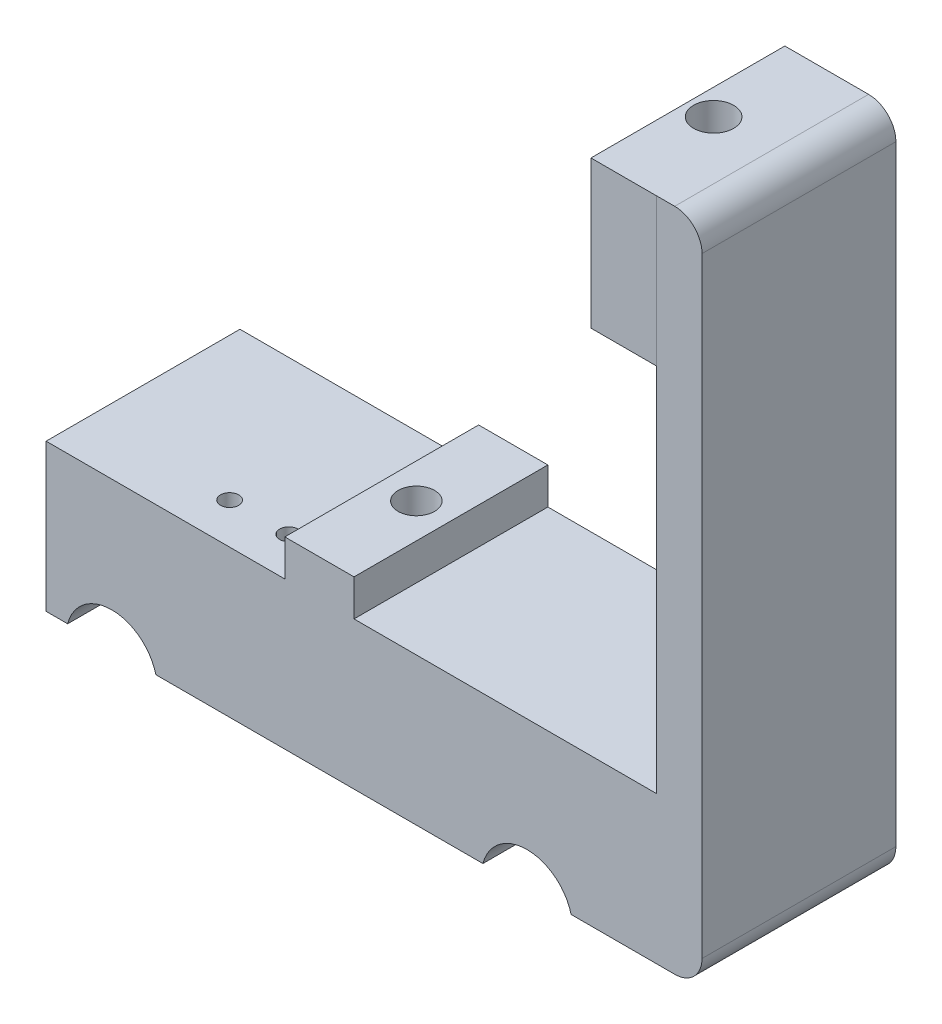
ISO-10303-21;
HEADER;
FILE_DESCRIPTION(('STEP AP214'),'2;1');
FILE_NAME('part.step','',(''),(''),'','','');
FILE_SCHEMA(('AUTOMOTIVE_DESIGN { 1 0 10303 214 1 1 1 1 }'));
ENDSEC;
DATA;
#1=APPLICATION_CONTEXT('core data for automotive mechanical design processes');
#2=APPLICATION_PROTOCOL_DEFINITION('international standard','automotive_design',2000,#1);
#3=PRODUCT_CONTEXT('',#1,'mechanical');
#4=PRODUCT('Part','Part','',(#3));
#5=PRODUCT_RELATED_PRODUCT_CATEGORY('part','',(#4));
#6=PRODUCT_DEFINITION_FORMATION('','',#4);
#7=PRODUCT_DEFINITION_CONTEXT('part definition',#1,'design');
#8=PRODUCT_DEFINITION('design','',#6,#7);
#9=PRODUCT_DEFINITION_SHAPE('','',#8);
#10=(LENGTH_UNIT() NAMED_UNIT(*) SI_UNIT(.MILLI.,.METRE.));
#11=(NAMED_UNIT(*) PLANE_ANGLE_UNIT() SI_UNIT($,.RADIAN.));
#12=(NAMED_UNIT(*) SI_UNIT($,.STERADIAN.) SOLID_ANGLE_UNIT());
#13=UNCERTAINTY_MEASURE_WITH_UNIT(LENGTH_MEASURE(1.E-05),#10,'distance_accuracy_value','');
#14=(GEOMETRIC_REPRESENTATION_CONTEXT(3) GLOBAL_UNCERTAINTY_ASSIGNED_CONTEXT((#13)) GLOBAL_UNIT_ASSIGNED_CONTEXT((#10,
#11,#12)) REPRESENTATION_CONTEXT('',''));
#15=CARTESIAN_POINT('',(0.,0.,0.));
#16=DIRECTION('',(0.,0.,1.));
#17=DIRECTION('',(1.,0.,0.));
#18=AXIS2_PLACEMENT_3D('',#15,#16,#17);
#19=CARTESIAN_POINT('',(37.,52.03,-10.6413287433298));
#20=DIRECTION('',(1.,0.,0.));
#21=DIRECTION('',(0.,1.,0.));
#22=AXIS2_PLACEMENT_3D('',#19,#20,#21);
#23=PLANE('',#22);
#24=DIRECTION('',(0.,0.,1.));
#25=VECTOR('',#24,1.);
#26=CARTESIAN_POINT('',(37.,35.85,10.6430024789024));
#27=LINE('',#26,#25);
#28=CARTESIAN_POINT('',(37.,35.85,-10.6413287433298));
#29=VERTEX_POINT('',#28);
#30=CARTESIAN_POINT('',(37.,35.85,10.64));
#31=VERTEX_POINT('',#30);
#32=EDGE_CURVE('E293',#29,#31,#27,.T.);
#33=ORIENTED_EDGE('',*,*,#32,.F.);
#34=DIRECTION('',(0.,-1.,0.));
#35=VECTOR('',#34,1.);
#36=CARTESIAN_POINT('',(37.,52.03,-10.6413287433298));
#37=LINE('',#36,#35);
#38=CARTESIAN_POINT('',(37.,-4.8,-10.6413287433298));
#39=VERTEX_POINT('',#38);
#40=EDGE_CURVE('E349',#29,#39,#37,.T.);
#41=ORIENTED_EDGE('',*,*,#40,.T.);
#42=DIRECTION('',(0.,0.,1.));
#43=VECTOR('',#42,1.);
#44=CARTESIAN_POINT('',(37.,-4.8,-10.6413287433298));
#45=LINE('',#44,#43);
#46=CARTESIAN_POINT('',(37.,-4.8,-10.64));
#47=VERTEX_POINT('',#46);
#48=EDGE_CURVE('E329',#39,#47,#45,.T.);
#49=ORIENTED_EDGE('',*,*,#48,.T.);
#50=CARTESIAN_POINT('',(37.,-4.8,10.64));
#51=VERTEX_POINT('',#50);
#52=EDGE_CURVE('E341',#47,#51,#45,.T.);
#53=ORIENTED_EDGE('',*,*,#52,.T.);
#54=DIRECTION('',(0.,-1.,0.));
#55=VECTOR('',#54,1.);
#56=CARTESIAN_POINT('',(37.,52.03,10.64));
#57=LINE('',#56,#55);
#58=EDGE_CURVE('E333',#31,#51,#57,.T.);
#59=ORIENTED_EDGE('',*,*,#58,.F.);
#60=EDGE_LOOP('',(#33,#41,#49,#53,#59));
#61=FACE_BOUND('',#60,.T.);
#62=ADVANCED_FACE('F51',(#61),#23,.F.);
#63=CARTESIAN_POINT('',(0.,-4.8,10.64));
#64=DIRECTION('',(0.,1.,0.));
#65=DIRECTION('',(-1.,0.,0.));
#66=AXIS2_PLACEMENT_3D('',#63,#64,#65);
#67=PLANE('',#66);
#68=CARTESIAN_POINT('',(32.6328780779036,-4.8,0.));
#69=DIRECTION('',(0.,1.,0.));
#70=DIRECTION('',(-1.,0.,0.));
#71=AXIS2_PLACEMENT_3D('',#68,#69,#70);
#72=CIRCLE('',#71,2.2);
#73=CARTESIAN_POINT('',(30.4328780779036,-4.8,0.));
#74=VERTEX_POINT('',#73);
#75=EDGE_CURVE('E267',#74,#74,#72,.T.);
#76=ORIENTED_EDGE('',*,*,#75,.F.);
#77=EDGE_LOOP('',(#76));
#78=FACE_BOUND('',#77,.T.);
#79=DIRECTION('',(1.,0.,0.));
#80=VECTOR('',#79,1.);
#81=CARTESIAN_POINT('',(0.,-4.8,10.64));
#82=LINE('',#81,#80);
#83=CARTESIAN_POINT('',(3.8,-4.8,10.64));
#84=VERTEX_POINT('',#83);
#85=EDGE_CURVE('E403',#84,#51,#82,.T.);
#86=ORIENTED_EDGE('',*,*,#85,.T.);
#87=ORIENTED_EDGE('',*,*,#52,.F.);
#88=DIRECTION('',(1.,0.,0.));
#89=VECTOR('',#88,1.);
#90=CARTESIAN_POINT('',(0.,-4.8,-10.64));
#91=LINE('',#90,#89);
#92=CARTESIAN_POINT('',(3.8,-4.8,-10.64));
#93=VERTEX_POINT('',#92);
#94=EDGE_CURVE('E223',#93,#47,#91,.T.);
#95=ORIENTED_EDGE('',*,*,#94,.F.);
#96=DIRECTION('',(0.,0.,-1.));
#97=VECTOR('',#96,1.);
#98=CARTESIAN_POINT('',(3.8,-4.8,10.64));
#99=LINE('',#98,#97);
#100=EDGE_CURVE('E235',#84,#93,#99,.T.);
#101=ORIENTED_EDGE('',*,*,#100,.F.);
#102=EDGE_LOOP('',(#86,#87,#95,#101));
#103=FACE_BOUND('',#102,.T.);
#104=ADVANCED_FACE('F429',(#78,#103),#67,.T.);
#105=CARTESIAN_POINT('',(0.,-20.98,10.64));
#106=DIRECTION('',(0.,1.,0.));
#107=DIRECTION('',(-1.,0.,0.));
#108=AXIS2_PLACEMENT_3D('',#105,#106,#107);
#109=PLANE('',#108);
#110=CARTESIAN_POINT('',(-7.82744134060951,-20.98,6.17035999216529));
#111=DIRECTION('',(0.,-1.,0.));
#112=DIRECTION('',(1.,0.,0.));
#113=AXIS2_PLACEMENT_3D('',#110,#111,#112);
#114=CIRCLE('',#113,1.);
#115=CARTESIAN_POINT('',(-6.82744134060951,-20.98,6.17035999216529));
#116=VERTEX_POINT('',#115);
#117=EDGE_CURVE('E574',#116,#116,#114,.T.);
#118=ORIENTED_EDGE('',*,*,#117,.F.);
#119=EDGE_LOOP('',(#118));
#120=FACE_BOUND('',#119,.T.);
#121=CARTESIAN_POINT('',(-14.3274413406095,-20.98,6.17035999216529));
#122=DIRECTION('',(0.,-1.,0.));
#123=DIRECTION('',(1.,0.,0.));
#124=AXIS2_PLACEMENT_3D('',#121,#122,#123);
#125=CIRCLE('',#124,0.999999999999999);
#126=CARTESIAN_POINT('',(-13.3274413406095,-20.98,6.17035999216529));
#127=VERTEX_POINT('',#126);
#128=EDGE_CURVE('E570',#127,#127,#125,.T.);
#129=ORIENTED_EDGE('',*,*,#128,.F.);
#130=EDGE_LOOP('',(#129));
#131=FACE_BOUND('',#130,.T.);
#132=CARTESIAN_POINT('',(0.000925950515747243,-20.98,0.));
#133=DIRECTION('',(0.,-1.,0.));
#134=DIRECTION('',(1.,0.,0.));
#135=AXIS2_PLACEMENT_3D('',#132,#133,#134);
#136=CIRCLE('',#135,2.);
#137=CARTESIAN_POINT('',(2.00092595051575,-20.98,0.));
#138=VERTEX_POINT('',#137);
#139=EDGE_CURVE('E283',#138,#138,#136,.T.);
#140=ORIENTED_EDGE('',*,*,#139,.F.);
#141=EDGE_LOOP('',(#140));
#142=FACE_BOUND('',#141,.T.);
#143=DIRECTION('',(0.,0.,-1.));
#144=VECTOR('',#143,1.);
#145=CARTESIAN_POINT('',(-17.9490740494843,-20.98,10.8));
#146=LINE('',#145,#144);
#147=CARTESIAN_POINT('',(-17.9490740494843,-20.98,-10.64));
#148=VERTEX_POINT('',#147);
#149=CARTESIAN_POINT('',(-17.9490740494843,-20.98,10.64));
#150=VERTEX_POINT('',#149);
#151=EDGE_CURVE('E391',#148,#150,#146,.F.);
#152=ORIENTED_EDGE('',*,*,#151,.F.);
#153=DIRECTION('',(1.,0.,0.));
#154=VECTOR('',#153,1.);
#155=CARTESIAN_POINT('',(0.,-20.98,-10.64));
#156=LINE('',#155,#154);
#157=CARTESIAN_POINT('',(17.9490740494842,-20.98,-10.64));
#158=VERTEX_POINT('',#157);
#159=EDGE_CURVE('E422',#148,#158,#156,.T.);
#160=ORIENTED_EDGE('',*,*,#159,.T.);
#161=DIRECTION('',(0.,0.,-1.));
#162=VECTOR('',#161,1.);
#163=CARTESIAN_POINT('',(17.9490740494843,-20.98,10.8));
#164=LINE('',#163,#162);
#165=CARTESIAN_POINT('',(17.9490740494842,-20.98,10.64));
#166=VERTEX_POINT('',#165);
#167=EDGE_CURVE('E378',#166,#158,#164,.T.);
#168=ORIENTED_EDGE('',*,*,#167,.F.);
#169=DIRECTION('',(1.,0.,0.));
#170=VECTOR('',#169,1.);
#171=CARTESIAN_POINT('',(0.,-20.98,10.64));
#172=LINE('',#171,#170);
#173=EDGE_CURVE('E404',#150,#166,#172,.T.);
#174=ORIENTED_EDGE('',*,*,#173,.F.);
#175=EDGE_LOOP('',(#152,#160,#168,#174));
#176=FACE_BOUND('',#175,.T.);
#177=ADVANCED_FACE('F488',(#120,#131,#142,#176),#109,.F.);
#178=DIRECTION('',(0.,0.,-1.));
#179=VECTOR('',#178,1.);
#180=CARTESIAN_POINT('',(-27.6328780779036,-20.98,10.8));
#181=LINE('',#180,#179);
#182=CARTESIAN_POINT('',(-27.6328780779036,-20.98,10.64));
#183=VERTEX_POINT('',#182);
#184=CARTESIAN_POINT('',(-27.6328780779036,-20.98,-10.64));
#185=VERTEX_POINT('',#184);
#186=EDGE_CURVE('E388',#183,#185,#181,.T.);
#187=ORIENTED_EDGE('',*,*,#186,.F.);
#188=CARTESIAN_POINT('',(-30.,-20.98,10.64));
#189=VERTEX_POINT('',#188);
#190=EDGE_CURVE('E399',#189,#183,#172,.T.);
#191=ORIENTED_EDGE('',*,*,#190,.F.);
#192=DIRECTION('',(0.,0.,-1.));
#193=VECTOR('',#192,1.);
#194=CARTESIAN_POINT('',(-30.,-20.98,10.64));
#195=LINE('',#194,#193);
#196=CARTESIAN_POINT('',(-30.,-20.98,-10.64));
#197=VERTEX_POINT('',#196);
#198=EDGE_CURVE('E239',#189,#197,#195,.T.);
#199=ORIENTED_EDGE('',*,*,#198,.T.);
#200=EDGE_CURVE('E419',#197,#185,#156,.T.);
#201=ORIENTED_EDGE('',*,*,#200,.T.);
#202=EDGE_LOOP('',(#187,#191,#199,#201));
#203=FACE_BOUND('',#202,.T.);
#204=ADVANCED_FACE('F547',(#203),#109,.F.);
#205=CARTESIAN_POINT('',(32.6328780779036,-20.98,0.));
#206=DIRECTION('',(0.,-1.,0.));
#207=DIRECTION('',(1.,0.,0.));
#208=AXIS2_PLACEMENT_3D('',#205,#206,#207);
#209=CIRCLE('',#208,2.2);
#210=CARTESIAN_POINT('',(34.8328780779036,-20.98,0.));
#211=VERTEX_POINT('',#210);
#212=EDGE_CURVE('E277',#211,#211,#209,.T.);
#213=ORIENTED_EDGE('',*,*,#212,.F.);
#214=EDGE_LOOP('',(#213));
#215=FACE_BOUND('',#214,.T.);
#216=CARTESIAN_POINT('',(27.6328780779036,-20.98,-10.64));
#217=VERTEX_POINT('',#216);
#218=CARTESIAN_POINT('',(39.,-20.98,-10.64));
#219=VERTEX_POINT('',#218);
#220=EDGE_CURVE('E418',#217,#219,#156,.T.);
#221=ORIENTED_EDGE('',*,*,#220,.T.);
#222=DIRECTION('',(0.,0.,-1.));
#223=VECTOR('',#222,1.);
#224=CARTESIAN_POINT('',(39.,-20.98,10.64));
#225=LINE('',#224,#223);
#226=CARTESIAN_POINT('',(39.,-20.98,10.64));
#227=VERTEX_POINT('',#226);
#228=EDGE_CURVE('E12',#219,#227,#225,.F.);
#229=ORIENTED_EDGE('',*,*,#228,.T.);
#230=CARTESIAN_POINT('',(27.6328780779036,-20.98,10.64));
#231=VERTEX_POINT('',#230);
#232=EDGE_CURVE('E398',#231,#227,#172,.T.);
#233=ORIENTED_EDGE('',*,*,#232,.F.);
#234=DIRECTION('',(0.,0.,-1.));
#235=VECTOR('',#234,1.);
#236=CARTESIAN_POINT('',(27.6328780779036,-20.98,10.8));
#237=LINE('',#236,#235);
#238=EDGE_CURVE('E381',#217,#231,#237,.F.);
#239=ORIENTED_EDGE('',*,*,#238,.F.);
#240=EDGE_LOOP('',(#221,#229,#233,#239));
#241=FACE_BOUND('',#240,.T.);
#242=ADVANCED_FACE('F477',(#215,#241),#109,.F.);
#243=CARTESIAN_POINT('',(-30.,0.,10.64));
#244=DIRECTION('',(1.,0.,0.));
#245=DIRECTION('',(0.,0.,-1.));
#246=AXIS2_PLACEMENT_3D('',#243,#244,#245);
#247=PLANE('',#246);
#248=DIRECTION('',(0.,-1.,0.));
#249=VECTOR('',#248,1.);
#250=CARTESIAN_POINT('',(-30.,0.,-10.64));
#251=LINE('',#250,#249);
#252=CARTESIAN_POINT('',(-30.,-4.8,-10.64));
#253=VERTEX_POINT('',#252);
#254=EDGE_CURVE('E394',#253,#197,#251,.T.);
#255=ORIENTED_EDGE('',*,*,#254,.T.);
#256=ORIENTED_EDGE('',*,*,#198,.F.);
#257=DIRECTION('',(0.,-1.,0.));
#258=VECTOR('',#257,1.);
#259=CARTESIAN_POINT('',(-30.,0.,10.64));
#260=LINE('',#259,#258);
#261=CARTESIAN_POINT('',(-30.,-4.8,10.64));
#262=VERTEX_POINT('',#261);
#263=EDGE_CURVE('E221',#262,#189,#260,.T.);
#264=ORIENTED_EDGE('',*,*,#263,.F.);
#265=DIRECTION('',(0.,0.,-1.));
#266=VECTOR('',#265,1.);
#267=CARTESIAN_POINT('',(-30.,-4.8,10.64));
#268=LINE('',#267,#266);
#269=EDGE_CURVE('E227',#262,#253,#268,.T.);
#270=ORIENTED_EDGE('',*,*,#269,.T.);
#271=EDGE_LOOP('',(#255,#256,#264,#270));
#272=FACE_BOUND('',#271,.T.);
#273=ADVANCED_FACE('F543',(#272),#247,.F.);
#274=CARTESIAN_POINT('',(3.8,0.,10.64));
#275=DIRECTION('',(1.,0.,0.));
#276=DIRECTION('',(0.,1.,0.));
#277=AXIS2_PLACEMENT_3D('',#274,#275,#276);
#278=PLANE('',#277);
#279=DIRECTION('',(0.,0.,-1.));
#280=VECTOR('',#279,1.);
#281=CARTESIAN_POINT('',(3.8,-0.8,10.64));
#282=LINE('',#281,#280);
#283=CARTESIAN_POINT('',(3.8,-0.8,10.64));
#284=VERTEX_POINT('',#283);
#285=CARTESIAN_POINT('',(3.8,-0.8,-10.64));
#286=VERTEX_POINT('',#285);
#287=EDGE_CURVE('E69',#284,#286,#282,.T.);
#288=ORIENTED_EDGE('',*,*,#287,.F.);
#289=DIRECTION('',(0.,-1.,0.));
#290=VECTOR('',#289,1.);
#291=CARTESIAN_POINT('',(3.8,0.,10.64));
#292=LINE('',#291,#290);
#293=EDGE_CURVE('E408',#284,#84,#292,.T.);
#294=ORIENTED_EDGE('',*,*,#293,.T.);
#295=ORIENTED_EDGE('',*,*,#100,.T.);
#296=DIRECTION('',(0.,-1.,0.));
#297=VECTOR('',#296,1.);
#298=CARTESIAN_POINT('',(3.8,0.,-10.64));
#299=LINE('',#298,#297);
#300=EDGE_CURVE('E217',#286,#93,#299,.T.);
#301=ORIENTED_EDGE('',*,*,#300,.F.);
#302=EDGE_LOOP('',(#288,#294,#295,#301));
#303=FACE_BOUND('',#302,.T.);
#304=ADVANCED_FACE('F541',(#303),#278,.T.);
#305=CARTESIAN_POINT('',(-3.8,0.,10.64));
#306=DIRECTION('',(1.,0.,0.));
#307=DIRECTION('',(0.,1.,0.));
#308=AXIS2_PLACEMENT_3D('',#305,#306,#307);
#309=PLANE('',#308);
#310=DIRECTION('',(0.,-1.,0.));
#311=VECTOR('',#310,1.);
#312=CARTESIAN_POINT('',(-3.8,0.,10.64));
#313=LINE('',#312,#311);
#314=CARTESIAN_POINT('',(-3.8,-0.8,10.64));
#315=VERTEX_POINT('',#314);
#316=CARTESIAN_POINT('',(-3.8,-4.8,10.64));
#317=VERTEX_POINT('',#316);
#318=EDGE_CURVE('E209',#315,#317,#313,.T.);
#319=ORIENTED_EDGE('',*,*,#318,.F.);
#320=DIRECTION('',(0.,0.,-1.));
#321=VECTOR('',#320,1.);
#322=CARTESIAN_POINT('',(-3.8,-0.8,10.64));
#323=LINE('',#322,#321);
#324=CARTESIAN_POINT('',(-3.8,-0.8,-10.64));
#325=VERTEX_POINT('',#324);
#326=EDGE_CURVE('E197',#315,#325,#323,.T.);
#327=ORIENTED_EDGE('',*,*,#326,.T.);
#328=DIRECTION('',(0.,-1.,0.));
#329=VECTOR('',#328,1.);
#330=CARTESIAN_POINT('',(-3.8,0.,-10.64));
#331=LINE('',#330,#329);
#332=CARTESIAN_POINT('',(-3.8,-4.8,-10.64));
#333=VERTEX_POINT('',#332);
#334=EDGE_CURVE('E207',#325,#333,#331,.T.);
#335=ORIENTED_EDGE('',*,*,#334,.T.);
#336=DIRECTION('',(0.,0.,-1.));
#337=VECTOR('',#336,1.);
#338=CARTESIAN_POINT('',(-3.8,-4.8,10.64));
#339=LINE('',#338,#337);
#340=EDGE_CURVE('E231',#317,#333,#339,.T.);
#341=ORIENTED_EDGE('',*,*,#340,.F.);
#342=EDGE_LOOP('',(#319,#327,#335,#341));
#343=FACE_BOUND('',#342,.T.);
#344=ADVANCED_FACE('F205',(#343),#309,.F.);
#345=CARTESIAN_POINT('',(0.,-4.8,10.64));
#346=DIRECTION('',(0.,-1.,0.));
#347=DIRECTION('',(1.,0.,0.));
#348=AXIS2_PLACEMENT_3D('',#345,#346,#347);
#349=PLANE('',#348);
#350=CARTESIAN_POINT('',(-7.82744134060951,-4.8,6.17035999216529));
#351=DIRECTION('',(0.,-1.,0.));
#352=DIRECTION('',(1.,0.,0.));
#353=AXIS2_PLACEMENT_3D('',#350,#351,#352);
#354=CIRCLE('',#353,1.);
#355=CARTESIAN_POINT('',(-6.82744134060951,-4.8,6.17035999216529));
#356=VERTEX_POINT('',#355);
#357=EDGE_CURVE('E579',#356,#356,#354,.F.);
#358=ORIENTED_EDGE('',*,*,#357,.F.);
#359=EDGE_LOOP('',(#358));
#360=FACE_BOUND('',#359,.T.);
#361=CARTESIAN_POINT('',(-14.3274413406095,-4.8,6.17035999216529));
#362=DIRECTION('',(0.,-1.,0.));
#363=DIRECTION('',(1.,0.,0.));
#364=AXIS2_PLACEMENT_3D('',#361,#362,#363);
#365=CIRCLE('',#364,0.999999999999999);
#366=CARTESIAN_POINT('',(-13.3274413406095,-4.8,6.17035999216529));
#367=VERTEX_POINT('',#366);
#368=EDGE_CURVE('E575',#367,#367,#365,.F.);
#369=ORIENTED_EDGE('',*,*,#368,.F.);
#370=EDGE_LOOP('',(#369));
#371=FACE_BOUND('',#370,.T.);
#372=DIRECTION('',(-1.,0.,0.));
#373=VECTOR('',#372,1.);
#374=CARTESIAN_POINT('',(0.,-4.8,-10.64));
#375=LINE('',#374,#373);
#376=EDGE_CURVE('E215',#333,#253,#375,.T.);
#377=ORIENTED_EDGE('',*,*,#376,.T.);
#378=ORIENTED_EDGE('',*,*,#269,.F.);
#379=DIRECTION('',(-1.,0.,0.));
#380=VECTOR('',#379,1.);
#381=CARTESIAN_POINT('',(0.,-4.8,10.64));
#382=LINE('',#381,#380);
#383=EDGE_CURVE('E232',#317,#262,#382,.T.);
#384=ORIENTED_EDGE('',*,*,#383,.F.);
#385=ORIENTED_EDGE('',*,*,#340,.T.);
#386=EDGE_LOOP('',(#377,#378,#384,#385));
#387=FACE_BOUND('',#386,.T.);
#388=ADVANCED_FACE('F533',(#360,#371,#387),#349,.F.);
#389=CARTESIAN_POINT('',(0.,0.,10.64));
#390=DIRECTION('',(0.,0.,1.));
#391=DIRECTION('',(1.,0.,0.));
#392=AXIS2_PLACEMENT_3D('',#389,#390,#391);
#393=PLANE('',#392);
#394=DIRECTION('',(1.,0.,0.));
#395=VECTOR('',#394,1.);
#396=CARTESIAN_POINT('',(0.,-0.8,10.64));
#397=LINE('',#396,#395);
#398=EDGE_CURVE('E563',#315,#284,#397,.T.);
#399=ORIENTED_EDGE('',*,*,#398,.F.);
#400=ORIENTED_EDGE('',*,*,#318,.T.);
#401=ORIENTED_EDGE('',*,*,#383,.T.);
#402=ORIENTED_EDGE('',*,*,#263,.T.);
#403=ORIENTED_EDGE('',*,*,#190,.T.);
#404=CARTESIAN_POINT('',(-22.7909760636939,-22.227391231648,10.64));
#405=DIRECTION('',(0.,0.,1.));
#406=DIRECTION('',(1.,0.,0.));
#407=AXIS2_PLACEMENT_3D('',#404,#405,#406);
#408=CIRCLE('',#407,5.);
#409=EDGE_CURVE('E384',#183,#150,#408,.F.);
#410=ORIENTED_EDGE('',*,*,#409,.T.);
#411=ORIENTED_EDGE('',*,*,#173,.T.);
#412=CARTESIAN_POINT('',(22.7909760636939,-22.227391231648,10.64));
#413=DIRECTION('',(0.,0.,1.));
#414=DIRECTION('',(1.,0.,0.));
#415=AXIS2_PLACEMENT_3D('',#412,#413,#414);
#416=CIRCLE('',#415,5.);
#417=EDGE_CURVE('E371',#166,#231,#416,.F.);
#418=ORIENTED_EDGE('',*,*,#417,.T.);
#419=ORIENTED_EDGE('',*,*,#232,.T.);
#420=CARTESIAN_POINT('',(39.,-17.98,10.64));
#421=DIRECTION('',(0.,0.,1.));
#422=DIRECTION('',(1.,0.,0.));
#423=AXIS2_PLACEMENT_3D('',#420,#421,#422);
#424=CIRCLE('',#423,3.);
#425=CARTESIAN_POINT('',(42.,-17.98,10.64));
#426=VERTEX_POINT('',#425);
#427=EDGE_CURVE('E257',#227,#426,#424,.T.);
#428=ORIENTED_EDGE('',*,*,#427,.T.);
#429=DIRECTION('',(0.,-1.,0.));
#430=VECTOR('',#429,1.);
#431=CARTESIAN_POINT('',(42.,-4.8,10.64));
#432=LINE('',#431,#430);
#433=CARTESIAN_POINT('',(42.,49.03,10.64));
#434=VERTEX_POINT('',#433);
#435=EDGE_CURVE('E359',#434,#426,#432,.T.);
#436=ORIENTED_EDGE('',*,*,#435,.F.);
#437=CARTESIAN_POINT('',(39.,49.03,10.64));
#438=DIRECTION('',(0.,0.,1.));
#439=DIRECTION('',(1.,0.,0.));
#440=AXIS2_PLACEMENT_3D('',#437,#438,#439);
#441=CIRCLE('',#440,3.);
#442=CARTESIAN_POINT('',(39.,52.03,10.64));
#443=VERTEX_POINT('',#442);
#444=EDGE_CURVE('E260',#434,#443,#441,.T.);
#445=ORIENTED_EDGE('',*,*,#444,.T.);
#446=DIRECTION('',(1.,0.,0.));
#447=VECTOR('',#446,1.);
#448=CARTESIAN_POINT('',(42.,52.03,10.64));
#449=LINE('',#448,#447);
#450=CARTESIAN_POINT('',(37.,52.03,10.64));
#451=VERTEX_POINT('',#450);
#452=EDGE_CURVE('E328',#451,#443,#449,.T.);
#453=ORIENTED_EDGE('',*,*,#452,.F.);
#454=EDGE_CURVE('E345',#451,#31,#57,.T.);
#455=ORIENTED_EDGE('',*,*,#454,.T.);
#456=ORIENTED_EDGE('',*,*,#58,.T.);
#457=ORIENTED_EDGE('',*,*,#85,.F.);
#458=ORIENTED_EDGE('',*,*,#293,.F.);
#459=EDGE_LOOP('',(#399,#400,#401,#402,#403,#410,#411,#418,#419,#428,#436,#445,#453,#455,#456,
#457,#458));
#460=FACE_BOUND('',#459,.T.);
#461=ADVANCED_FACE('F480',(#460),#393,.T.);
#462=CARTESIAN_POINT('',(0.,0.,-10.64));
#463=DIRECTION('',(0.,0.,1.));
#464=DIRECTION('',(1.,0.,0.));
#465=AXIS2_PLACEMENT_3D('',#462,#463,#464);
#466=PLANE('',#465);
#467=ORIENTED_EDGE('',*,*,#334,.F.);
#468=DIRECTION('',(1.,0.,0.));
#469=VECTOR('',#468,1.);
#470=CARTESIAN_POINT('',(0.,-0.8,-10.64));
#471=LINE('',#470,#469);
#472=EDGE_CURVE('E193',#325,#286,#471,.T.);
#473=ORIENTED_EDGE('',*,*,#472,.T.);
#474=ORIENTED_EDGE('',*,*,#300,.T.);
#475=ORIENTED_EDGE('',*,*,#94,.T.);
#476=DIRECTION('',(1.,0.,0.));
#477=VECTOR('',#476,1.);
#478=CARTESIAN_POINT('',(0.,-4.8,-10.64));
#479=LINE('',#478,#477);
#480=CARTESIAN_POINT('',(42.,-4.79999999999999,-10.64));
#481=VERTEX_POINT('',#480);
#482=EDGE_CURVE('E355',#47,#481,#479,.T.);
#483=ORIENTED_EDGE('',*,*,#482,.T.);
#484=DIRECTION('',(0.,1.,0.));
#485=VECTOR('',#484,1.);
#486=CARTESIAN_POINT('',(42.,-4.8,-10.64));
#487=LINE('',#486,#485);
#488=CARTESIAN_POINT('',(42.,-17.98,-10.64));
#489=VERTEX_POINT('',#488);
#490=EDGE_CURVE('E363',#489,#481,#487,.T.);
#491=ORIENTED_EDGE('',*,*,#490,.F.);
#492=CARTESIAN_POINT('',(39.,-17.98,-10.64));
#493=DIRECTION('',(0.,0.,1.));
#494=DIRECTION('',(1.,0.,0.));
#495=AXIS2_PLACEMENT_3D('',#492,#493,#494);
#496=CIRCLE('',#495,3.);
#497=EDGE_CURVE('E61',#489,#219,#496,.F.);
#498=ORIENTED_EDGE('',*,*,#497,.T.);
#499=ORIENTED_EDGE('',*,*,#220,.F.);
#500=CARTESIAN_POINT('',(22.7909760636939,-22.227391231648,-10.64));
#501=DIRECTION('',(0.,0.,1.));
#502=DIRECTION('',(-1.,0.,0.));
#503=AXIS2_PLACEMENT_3D('',#500,#501,#502);
#504=CIRCLE('',#503,5.);
#505=EDGE_CURVE('E366',#217,#158,#504,.T.);
#506=ORIENTED_EDGE('',*,*,#505,.T.);
#507=ORIENTED_EDGE('',*,*,#159,.F.);
#508=CARTESIAN_POINT('',(-22.7909760636939,-22.227391231648,-10.64));
#509=DIRECTION('',(0.,0.,1.));
#510=DIRECTION('',(1.,0.,0.));
#511=AXIS2_PLACEMENT_3D('',#508,#509,#510);
#512=CIRCLE('',#511,5.);
#513=EDGE_CURVE('E367',#148,#185,#512,.T.);
#514=ORIENTED_EDGE('',*,*,#513,.T.);
#515=ORIENTED_EDGE('',*,*,#200,.F.);
#516=ORIENTED_EDGE('',*,*,#254,.F.);
#517=ORIENTED_EDGE('',*,*,#376,.F.);
#518=EDGE_LOOP('',(#467,#473,#474,#475,#483,#491,#498,#499,#506,#507,#514,#515,#516,#517));
#519=FACE_BOUND('',#518,.T.);
#520=ADVANCED_FACE('F213',(#519),#466,.F.);
#521=CARTESIAN_POINT('',(22.7909760636939,-22.227391231648,10.8));
#522=DIRECTION('',(0.,0.,-1.));
#523=DIRECTION('',(-1.,0.,0.));
#524=AXIS2_PLACEMENT_3D('',#521,#522,#523);
#525=CYLINDRICAL_SURFACE('',#524,5.);
#526=ORIENTED_EDGE('',*,*,#238,.T.);
#527=ORIENTED_EDGE('',*,*,#417,.F.);
#528=ORIENTED_EDGE('',*,*,#167,.T.);
#529=ORIENTED_EDGE('',*,*,#505,.F.);
#530=EDGE_LOOP('',(#526,#527,#528,#529));
#531=FACE_BOUND('',#530,.T.);
#532=ADVANCED_FACE('F492',(#531),#525,.F.);
#533=CARTESIAN_POINT('',(-22.7909760636939,-22.227391231648,10.8));
#534=DIRECTION('',(0.,0.,-1.));
#535=DIRECTION('',(-1.,0.,0.));
#536=AXIS2_PLACEMENT_3D('',#533,#534,#535);
#537=CYLINDRICAL_SURFACE('',#536,5.);
#538=ORIENTED_EDGE('',*,*,#151,.T.);
#539=ORIENTED_EDGE('',*,*,#409,.F.);
#540=ORIENTED_EDGE('',*,*,#186,.T.);
#541=ORIENTED_EDGE('',*,*,#513,.F.);
#542=EDGE_LOOP('',(#538,#539,#540,#541));
#543=FACE_BOUND('',#542,.T.);
#544=ADVANCED_FACE('F525',(#543),#537,.F.);
#545=CARTESIAN_POINT('',(42.,0.,0.));
#546=DIRECTION('',(1.,0.,0.));
#547=DIRECTION('',(0.,0.,-1.));
#548=AXIS2_PLACEMENT_3D('',#545,#546,#547);
#549=PLANE('',#548);
#550=DIRECTION('',(0.,-1.,0.));
#551=VECTOR('',#550,1.);
#552=CARTESIAN_POINT('',(42.,52.03,-10.6413287433298));
#553=LINE('',#552,#551);
#554=CARTESIAN_POINT('',(42.,49.03,-10.6413287433298));
#555=VERTEX_POINT('',#554);
#556=CARTESIAN_POINT('',(42.,-4.79999999999999,-10.6413287433298));
#557=VERTEX_POINT('',#556);
#558=EDGE_CURVE('E352',#555,#557,#553,.T.);
#559=ORIENTED_EDGE('',*,*,#558,.F.);
#560=DIRECTION('',(0.,0.,-1.));
#561=VECTOR('',#560,1.);
#562=CARTESIAN_POINT('',(42.,49.03,10.64));
#563=LINE('',#562,#561);
#564=EDGE_CURVE('E254',#555,#434,#563,.F.);
#565=ORIENTED_EDGE('',*,*,#564,.T.);
#566=ORIENTED_EDGE('',*,*,#435,.T.);
#567=DIRECTION('',(0.,0.,-1.));
#568=VECTOR('',#567,1.);
#569=CARTESIAN_POINT('',(42.,-17.98,-10.64));
#570=LINE('',#569,#568);
#571=EDGE_CURVE('E250',#426,#489,#570,.T.);
#572=ORIENTED_EDGE('',*,*,#571,.T.);
#573=ORIENTED_EDGE('',*,*,#490,.T.);
#574=DIRECTION('',(0.,0.,-1.));
#575=VECTOR('',#574,1.);
#576=CARTESIAN_POINT('',(42.,-4.79999999999999,-10.6413287433298));
#577=LINE('',#576,#575);
#578=EDGE_CURVE('E324',#481,#557,#577,.T.);
#579=ORIENTED_EDGE('',*,*,#578,.T.);
#580=EDGE_LOOP('',(#559,#565,#566,#572,#573,#579));
#581=FACE_BOUND('',#580,.T.);
#582=ADVANCED_FACE('F467',(#581),#549,.T.);
#583=CARTESIAN_POINT('',(0.,-4.8,0.));
#584=DIRECTION('',(0.,-1.,0.));
#585=DIRECTION('',(1.,0.,0.));
#586=AXIS2_PLACEMENT_3D('',#583,#584,#585);
#587=PLANE('',#586);
#588=ORIENTED_EDGE('',*,*,#482,.F.);
#589=ORIENTED_EDGE('',*,*,#48,.F.);
#590=DIRECTION('',(-1.,0.,0.));
#591=VECTOR('',#590,1.);
#592=CARTESIAN_POINT('',(42.,-4.79999999999999,-10.6413287433298));
#593=LINE('',#592,#591);
#594=EDGE_CURVE('E337',#557,#39,#593,.T.);
#595=ORIENTED_EDGE('',*,*,#594,.F.);
#596=ORIENTED_EDGE('',*,*,#578,.F.);
#597=EDGE_LOOP('',(#588,#589,#595,#596));
#598=FACE_BOUND('',#597,.T.);
#599=ADVANCED_FACE('F465',(#598),#587,.T.);
#600=CARTESIAN_POINT('',(42.,52.03,-10.6413287433298));
#601=DIRECTION('',(0.,0.,1.));
#602=DIRECTION('',(1.,0.,0.));
#603=AXIS2_PLACEMENT_3D('',#600,#601,#602);
#604=PLANE('',#603);
#605=DIRECTION('',(-1.,0.,0.));
#606=VECTOR('',#605,1.);
#607=CARTESIAN_POINT('',(42.,52.03,-10.6413287433298));
#608=LINE('',#607,#606);
#609=CARTESIAN_POINT('',(39.,52.03,-10.6413287433298));
#610=VERTEX_POINT('',#609);
#611=CARTESIAN_POINT('',(29.81,52.03,-10.6413287433298));
#612=VERTEX_POINT('',#611);
#613=EDGE_CURVE('E325',#610,#612,#608,.T.);
#614=ORIENTED_EDGE('',*,*,#613,.F.);
#615=CARTESIAN_POINT('',(39.,49.03,-10.6413287433298));
#616=DIRECTION('',(0.,0.,1.));
#617=DIRECTION('',(1.,0.,0.));
#618=AXIS2_PLACEMENT_3D('',#615,#616,#617);
#619=CIRCLE('',#618,3.);
#620=EDGE_CURVE('E247',#610,#555,#619,.F.);
#621=ORIENTED_EDGE('',*,*,#620,.T.);
#622=ORIENTED_EDGE('',*,*,#558,.T.);
#623=ORIENTED_EDGE('',*,*,#594,.T.);
#624=ORIENTED_EDGE('',*,*,#40,.F.);
#625=DIRECTION('',(1.,0.,0.));
#626=VECTOR('',#625,1.);
#627=CARTESIAN_POINT('',(29.81,35.85,-10.6413287433298));
#628=LINE('',#627,#626);
#629=CARTESIAN_POINT('',(29.81,35.85,-10.6413287433298));
#630=VERTEX_POINT('',#629);
#631=EDGE_CURVE('E317',#630,#29,#628,.T.);
#632=ORIENTED_EDGE('',*,*,#631,.F.);
#633=DIRECTION('',(0.,-1.,0.));
#634=VECTOR('',#633,1.);
#635=CARTESIAN_POINT('',(29.81,52.03,-10.6413287433298));
#636=LINE('',#635,#634);
#637=EDGE_CURVE('E297',#612,#630,#636,.T.);
#638=ORIENTED_EDGE('',*,*,#637,.F.);
#639=EDGE_LOOP('',(#614,#621,#622,#623,#624,#632,#638));
#640=FACE_BOUND('',#639,.T.);
#641=ADVANCED_FACE('F459',(#640),#604,.F.);
#642=CARTESIAN_POINT('',(0.,52.03,0.));
#643=DIRECTION('',(0.,-1.,0.));
#644=DIRECTION('',(1.,0.,0.));
#645=AXIS2_PLACEMENT_3D('',#642,#643,#644);
#646=PLANE('',#645);
#647=CARTESIAN_POINT('',(32.6328780779036,52.03,0.));
#648=DIRECTION('',(0.,-1.,0.));
#649=DIRECTION('',(1.,0.,0.));
#650=AXIS2_PLACEMENT_3D('',#647,#648,#649);
#651=CIRCLE('',#650,2.2);
#652=CARTESIAN_POINT('',(34.8328780779036,52.03,0.));
#653=VERTEX_POINT('',#652);
#654=EDGE_CURVE('E268',#653,#653,#651,.T.);
#655=ORIENTED_EDGE('',*,*,#654,.T.);
#656=EDGE_LOOP('',(#655));
#657=FACE_BOUND('',#656,.T.);
#658=ORIENTED_EDGE('',*,*,#452,.T.);
#659=DIRECTION('',(0.,0.,-1.));
#660=VECTOR('',#659,1.);
#661=CARTESIAN_POINT('',(39.,52.03,-10.6413287433298));
#662=LINE('',#661,#660);
#663=EDGE_CURVE('E243',#443,#610,#662,.T.);
#664=ORIENTED_EDGE('',*,*,#663,.T.);
#665=ORIENTED_EDGE('',*,*,#613,.T.);
#666=DIRECTION('',(0.,0.,-1.));
#667=VECTOR('',#666,1.);
#668=CARTESIAN_POINT('',(29.81,52.03,10.6430024789024));
#669=LINE('',#668,#667);
#670=CARTESIAN_POINT('',(29.81,52.03,10.6430024789024));
#671=VERTEX_POINT('',#670);
#672=EDGE_CURVE('E292',#671,#612,#669,.T.);
#673=ORIENTED_EDGE('',*,*,#672,.F.);
#674=DIRECTION('',(1.,0.,0.));
#675=VECTOR('',#674,1.);
#676=CARTESIAN_POINT('',(29.81,52.03,10.6430024789024));
#677=LINE('',#676,#675);
#678=CARTESIAN_POINT('',(37.,52.03,10.6430024789024));
#679=VERTEX_POINT('',#678);
#680=EDGE_CURVE('E320',#671,#679,#677,.T.);
#681=ORIENTED_EDGE('',*,*,#680,.T.);
#682=DIRECTION('',(0.,0.,-1.));
#683=VECTOR('',#682,1.);
#684=CARTESIAN_POINT('',(37.,52.03,10.6430024789024));
#685=LINE('',#684,#683);
#686=EDGE_CURVE('E307',#679,#451,#685,.T.);
#687=ORIENTED_EDGE('',*,*,#686,.T.);
#688=EDGE_LOOP('',(#658,#664,#665,#673,#681,#687));
#689=FACE_BOUND('',#688,.T.);
#690=ADVANCED_FACE('F451',(#657,#689),#646,.F.);
#691=CARTESIAN_POINT('',(29.81,52.03,10.6430024789024));
#692=DIRECTION('',(0.,0.,-1.));
#693=DIRECTION('',(0.,1.,0.));
#694=AXIS2_PLACEMENT_3D('',#691,#692,#693);
#695=PLANE('',#694);
#696=DIRECTION('',(0.,1.,0.));
#697=VECTOR('',#696,1.);
#698=CARTESIAN_POINT('',(37.,52.03,10.6430024789024));
#699=LINE('',#698,#697);
#700=CARTESIAN_POINT('',(37.,35.85,10.6430024789024));
#701=VERTEX_POINT('',#700);
#702=EDGE_CURVE('E274',#701,#679,#699,.T.);
#703=ORIENTED_EDGE('',*,*,#702,.T.);
#704=ORIENTED_EDGE('',*,*,#680,.F.);
#705=DIRECTION('',(0.,1.,0.));
#706=VECTOR('',#705,1.);
#707=CARTESIAN_POINT('',(29.81,52.03,10.6430024789024));
#708=LINE('',#707,#706);
#709=CARTESIAN_POINT('',(29.81,35.85,10.6430024789024));
#710=VERTEX_POINT('',#709);
#711=EDGE_CURVE('E288',#710,#671,#708,.T.);
#712=ORIENTED_EDGE('',*,*,#711,.F.);
#713=DIRECTION('',(1.,0.,0.));
#714=VECTOR('',#713,1.);
#715=CARTESIAN_POINT('',(29.81,35.85,10.6430024789024));
#716=LINE('',#715,#714);
#717=EDGE_CURVE('E303',#710,#701,#716,.T.);
#718=ORIENTED_EDGE('',*,*,#717,.T.);
#719=EDGE_LOOP('',(#703,#704,#712,#718));
#720=FACE_BOUND('',#719,.T.);
#721=ADVANCED_FACE('F446',(#720),#695,.F.);
#722=CARTESIAN_POINT('',(29.81,35.85,10.6430024789024));
#723=DIRECTION('',(0.,1.,0.));
#724=DIRECTION('',(0.,0.,1.));
#725=AXIS2_PLACEMENT_3D('',#722,#723,#724);
#726=PLANE('',#725);
#727=CARTESIAN_POINT('',(32.6328780779036,35.85,0.));
#728=DIRECTION('',(0.,1.,0.));
#729=DIRECTION('',(0.,0.,1.));
#730=AXIS2_PLACEMENT_3D('',#727,#728,#729);
#731=CIRCLE('',#730,2.2);
#732=CARTESIAN_POINT('',(32.6328780779036,35.85,2.2));
#733=VERTEX_POINT('',#732);
#734=EDGE_CURVE('E264',#733,#733,#731,.T.);
#735=ORIENTED_EDGE('',*,*,#734,.T.);
#736=EDGE_LOOP('',(#735));
#737=FACE_BOUND('',#736,.T.);
#738=ORIENTED_EDGE('',*,*,#32,.T.);
#739=EDGE_CURVE('E310',#31,#701,#27,.T.);
#740=ORIENTED_EDGE('',*,*,#739,.T.);
#741=ORIENTED_EDGE('',*,*,#717,.F.);
#742=DIRECTION('',(0.,0.,1.));
#743=VECTOR('',#742,1.);
#744=CARTESIAN_POINT('',(29.81,35.85,10.6430024789024));
#745=LINE('',#744,#743);
#746=EDGE_CURVE('E300',#630,#710,#745,.T.);
#747=ORIENTED_EDGE('',*,*,#746,.F.);
#748=ORIENTED_EDGE('',*,*,#631,.T.);
#749=EDGE_LOOP('',(#738,#740,#741,#747,#748));
#750=FACE_BOUND('',#749,.T.);
#751=ADVANCED_FACE('F438',(#737,#750),#726,.F.);
#752=CARTESIAN_POINT('',(29.81,0.,0.));
#753=DIRECTION('',(1.,0.,0.));
#754=DIRECTION('',(0.,0.,-1.));
#755=AXIS2_PLACEMENT_3D('',#752,#753,#754);
#756=PLANE('',#755);
#757=ORIENTED_EDGE('',*,*,#711,.T.);
#758=ORIENTED_EDGE('',*,*,#672,.T.);
#759=ORIENTED_EDGE('',*,*,#637,.T.);
#760=ORIENTED_EDGE('',*,*,#746,.T.);
#761=EDGE_LOOP('',(#757,#758,#759,#760));
#762=FACE_BOUND('',#761,.T.);
#763=ADVANCED_FACE('F455',(#762),#756,.F.);
#764=CARTESIAN_POINT('',(37.,0.,0.));
#765=DIRECTION('',(1.,0.,0.));
#766=DIRECTION('',(0.,0.,-1.));
#767=AXIS2_PLACEMENT_3D('',#764,#765,#766);
#768=PLANE('',#767);
#769=ORIENTED_EDGE('',*,*,#739,.F.);
#770=ORIENTED_EDGE('',*,*,#454,.F.);
#771=ORIENTED_EDGE('',*,*,#686,.F.);
#772=ORIENTED_EDGE('',*,*,#702,.F.);
#773=EDGE_LOOP('',(#769,#770,#771,#772));
#774=FACE_BOUND('',#773,.T.);
#775=ADVANCED_FACE('F448',(#774),#768,.T.);
#776=CARTESIAN_POINT('',(39.,49.03,0.));
#777=DIRECTION('',(0.,0.,1.));
#778=DIRECTION('',(1.,0.,0.));
#779=AXIS2_PLACEMENT_3D('',#776,#777,#778);
#780=CYLINDRICAL_SURFACE('',#779,3.);
#781=ORIENTED_EDGE('',*,*,#444,.F.);
#782=ORIENTED_EDGE('',*,*,#564,.F.);
#783=ORIENTED_EDGE('',*,*,#620,.F.);
#784=ORIENTED_EDGE('',*,*,#663,.F.);
#785=EDGE_LOOP('',(#781,#782,#783,#784));
#786=FACE_BOUND('',#785,.T.);
#787=ADVANCED_FACE('F500',(#786),#780,.T.);
#788=CARTESIAN_POINT('',(39.,-17.98,0.));
#789=DIRECTION('',(0.,0.,1.));
#790=DIRECTION('',(1.,0.,0.));
#791=AXIS2_PLACEMENT_3D('',#788,#789,#790);
#792=CYLINDRICAL_SURFACE('',#791,3.);
#793=ORIENTED_EDGE('',*,*,#427,.F.);
#794=ORIENTED_EDGE('',*,*,#228,.F.);
#795=ORIENTED_EDGE('',*,*,#497,.F.);
#796=ORIENTED_EDGE('',*,*,#571,.F.);
#797=EDGE_LOOP('',(#793,#794,#795,#796));
#798=FACE_BOUND('',#797,.T.);
#799=ADVANCED_FACE('F53',(#798),#792,.T.);
#800=CARTESIAN_POINT('',(32.6328780779036,52.03,0.));
#801=DIRECTION('',(0.,-1.,0.));
#802=DIRECTION('',(1.,0.,0.));
#803=AXIS2_PLACEMENT_3D('',#800,#801,#802);
#804=CYLINDRICAL_SURFACE('',#803,2.2);
#805=ORIENTED_EDGE('',*,*,#654,.F.);
#806=EDGE_LOOP('',(#805));
#807=FACE_BOUND('',#806,.T.);
#808=ORIENTED_EDGE('',*,*,#734,.F.);
#809=EDGE_LOOP('',(#808));
#810=FACE_BOUND('',#809,.T.);
#811=ADVANCED_FACE('F506',(#807,#810),#804,.F.);
#812=ORIENTED_EDGE('',*,*,#75,.T.);
#813=EDGE_LOOP('',(#812));
#814=FACE_BOUND('',#813,.T.);
#815=ORIENTED_EDGE('',*,*,#212,.T.);
#816=EDGE_LOOP('',(#815));
#817=FACE_BOUND('',#816,.T.);
#818=ADVANCED_FACE('F596',(#814,#817),#804,.F.);
#819=CARTESIAN_POINT('',(0.0009259505157388,52.03,0.));
#820=DIRECTION('',(0.,-1.,0.));
#821=DIRECTION('',(1.,0.,0.));
#822=AXIS2_PLACEMENT_3D('',#819,#820,#821);
#823=CYLINDRICAL_SURFACE('',#822,2.);
#824=CARTESIAN_POINT('',(0.000925950515744909,-0.800000000000002,0.));
#825=DIRECTION('',(0.,-1.,0.));
#826=DIRECTION('',(0.,0.,-1.));
#827=AXIS2_PLACEMENT_3D('',#824,#825,#826);
#828=CIRCLE('',#827,2.);
#829=CARTESIAN_POINT('',(0.000925950515744909,-0.800000000000002,-2.));
#830=VERTEX_POINT('',#829);
#831=EDGE_CURVE('E55',#830,#830,#828,.F.);
#832=ORIENTED_EDGE('',*,*,#831,.T.);
#833=EDGE_LOOP('',(#832));
#834=FACE_BOUND('',#833,.T.);
#835=ORIENTED_EDGE('',*,*,#139,.T.);
#836=EDGE_LOOP('',(#835));
#837=FACE_BOUND('',#836,.T.);
#838=ADVANCED_FACE('F594',(#834,#837),#823,.F.);
#839=CARTESIAN_POINT('',(-12.6097811034459,-0.8,-10.6413287433298));
#840=DIRECTION('',(0.,-1.,0.));
#841=DIRECTION('',(0.,0.,-1.));
#842=AXIS2_PLACEMENT_3D('',#839,#840,#841);
#843=PLANE('',#842);
#844=ORIENTED_EDGE('',*,*,#398,.T.);
#845=ORIENTED_EDGE('',*,*,#287,.T.);
#846=ORIENTED_EDGE('',*,*,#472,.F.);
#847=ORIENTED_EDGE('',*,*,#326,.F.);
#848=EDGE_LOOP('',(#844,#845,#846,#847));
#849=FACE_BOUND('',#848,.T.);
#850=ORIENTED_EDGE('',*,*,#831,.F.);
#851=EDGE_LOOP('',(#850));
#852=FACE_BOUND('',#851,.T.);
#853=ADVANCED_FACE('F195',(#849,#852),#843,.F.);
#854=CARTESIAN_POINT('',(-14.3274413406095,52.031,6.17035999216529));
#855=DIRECTION('',(0.,-1.,0.));
#856=DIRECTION('',(1.,0.,0.));
#857=AXIS2_PLACEMENT_3D('',#854,#855,#856);
#858=CYLINDRICAL_SURFACE('',#857,0.999999999999999);
#859=ORIENTED_EDGE('',*,*,#128,.T.);
#860=EDGE_LOOP('',(#859));
#861=FACE_BOUND('',#860,.T.);
#862=ORIENTED_EDGE('',*,*,#368,.T.);
#863=EDGE_LOOP('',(#862));
#864=FACE_BOUND('',#863,.T.);
#865=ADVANCED_FACE('F602',(#861,#864),#858,.F.);
#866=CARTESIAN_POINT('',(-7.82744134060952,52.031,6.17035999216529));
#867=DIRECTION('',(0.,-1.,0.));
#868=DIRECTION('',(1.,0.,0.));
#869=AXIS2_PLACEMENT_3D('',#866,#867,#868);
#870=CYLINDRICAL_SURFACE('',#869,1.);
#871=ORIENTED_EDGE('',*,*,#117,.T.);
#872=EDGE_LOOP('',(#871));
#873=FACE_BOUND('',#872,.T.);
#874=ORIENTED_EDGE('',*,*,#357,.T.);
#875=EDGE_LOOP('',(#874));
#876=FACE_BOUND('',#875,.T.);
#877=ADVANCED_FACE('F587',(#873,#876),#870,.F.);
#878=CLOSED_SHELL('',(#62,#104,#177,#204,#242,#273,#304,#344,#388,#461,#520,#532,#544,#582,#599,
#641,#690,#721,#751,#763,#775,#787,#799,#811,#818,#838,#853,#865,#877));
#879=MANIFOLD_SOLID_BREP('B2',#878);
#880=ADVANCED_BREP_SHAPE_REPRESENTATION('',(#18,#879),#14);
#881=SHAPE_DEFINITION_REPRESENTATION(#9,#880);
ENDSEC;
END-ISO-10303-21;
